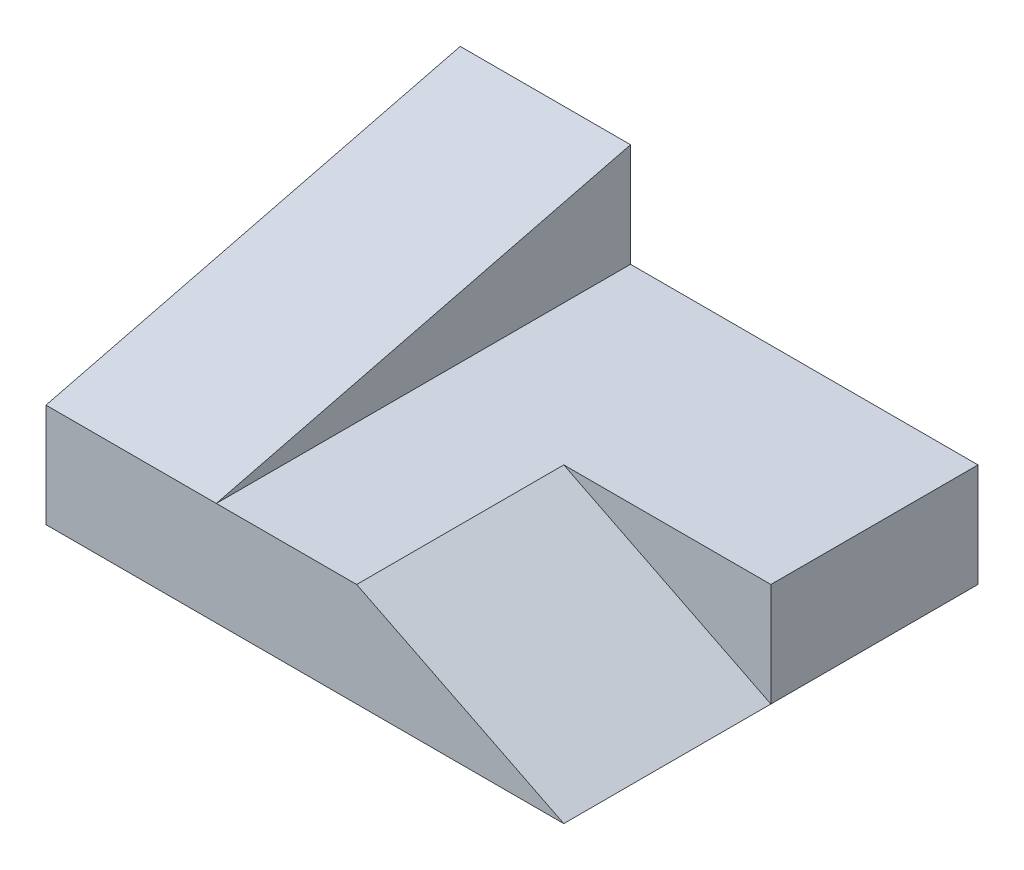
ISO-10303-21;
HEADER;
FILE_DESCRIPTION(('STEP AP214'),'2;1');
FILE_NAME('part.step','',(''),(''),'','','');
FILE_SCHEMA(('AUTOMOTIVE_DESIGN { 1 0 10303 214 1 1 1 1 }'));
ENDSEC;
DATA;
#1=APPLICATION_CONTEXT('core data for automotive mechanical design processes');
#2=APPLICATION_PROTOCOL_DEFINITION('international standard','automotive_design',2000,#1);
#3=PRODUCT_CONTEXT('',#1,'mechanical');
#4=PRODUCT('Part','Part','',(#3));
#5=PRODUCT_RELATED_PRODUCT_CATEGORY('part','',(#4));
#6=PRODUCT_DEFINITION_FORMATION('','',#4);
#7=PRODUCT_DEFINITION_CONTEXT('part definition',#1,'design');
#8=PRODUCT_DEFINITION('design','',#6,#7);
#9=PRODUCT_DEFINITION_SHAPE('','',#8);
#10=(LENGTH_UNIT() NAMED_UNIT(*) SI_UNIT(.MILLI.,.METRE.));
#11=(NAMED_UNIT(*) PLANE_ANGLE_UNIT() SI_UNIT($,.RADIAN.));
#12=(NAMED_UNIT(*) SI_UNIT($,.STERADIAN.) SOLID_ANGLE_UNIT());
#13=UNCERTAINTY_MEASURE_WITH_UNIT(LENGTH_MEASURE(1.E-05),#10,'distance_accuracy_value','');
#14=(GEOMETRIC_REPRESENTATION_CONTEXT(3) GLOBAL_UNCERTAINTY_ASSIGNED_CONTEXT((#13)) GLOBAL_UNIT_ASSIGNED_CONTEXT((#10,
#11,#12)) REPRESENTATION_CONTEXT('',''));
#15=CARTESIAN_POINT('',(0.,0.,0.));
#16=DIRECTION('',(0.,0.,1.));
#17=DIRECTION('',(1.,0.,0.));
#18=AXIS2_PLACEMENT_3D('',#15,#16,#17);
#19=CARTESIAN_POINT('',(0.,10.,0.));
#20=DIRECTION('',(0.,-1.,0.));
#21=DIRECTION('',(0.,0.,-1.));
#22=AXIS2_PLACEMENT_3D('',#19,#20,#21);
#23=PLANE('',#22);
#24=DIRECTION('',(1.,0.,0.));
#25=VECTOR('',#24,1.);
#26=CARTESIAN_POINT('',(-25.,10.,20.));
#27=LINE('',#26,#25);
#28=CARTESIAN_POINT('',(-8.55325315457413,10.,20.));
#29=VERTEX_POINT('',#28);
#30=CARTESIAN_POINT('',(4.99999999999999,10.,20.));
#31=VERTEX_POINT('',#30);
#32=EDGE_CURVE('E88',#29,#31,#27,.T.);
#33=ORIENTED_EDGE('',*,*,#32,.T.);
#34=DIRECTION('',(0.,0.,1.));
#35=VECTOR('',#34,1.);
#36=CARTESIAN_POINT('',(4.99999999999999,10.,0.));
#37=LINE('',#36,#35);
#38=CARTESIAN_POINT('',(4.99999999999999,10.,0.));
#39=VERTEX_POINT('',#38);
#40=EDGE_CURVE('E128',#39,#31,#37,.T.);
#41=ORIENTED_EDGE('',*,*,#40,.F.);
#42=DIRECTION('',(-1.,0.,0.));
#43=VECTOR('',#42,1.);
#44=CARTESIAN_POINT('',(25.,10.,0.));
#45=LINE('',#44,#43);
#46=CARTESIAN_POINT('',(25.,10.,0.));
#47=VERTEX_POINT('',#46);
#48=EDGE_CURVE('E134',#47,#39,#45,.T.);
#49=ORIENTED_EDGE('',*,*,#48,.F.);
#50=DIRECTION('',(0.,0.,-1.));
#51=VECTOR('',#50,1.);
#52=CARTESIAN_POINT('',(25.,10.,20.));
#53=LINE('',#52,#51);
#54=CARTESIAN_POINT('',(25.,10.,-20.));
#55=VERTEX_POINT('',#54);
#56=EDGE_CURVE('E56',#47,#55,#53,.T.);
#57=ORIENTED_EDGE('',*,*,#56,.T.);
#58=DIRECTION('',(-1.,0.,0.));
#59=VECTOR('',#58,1.);
#60=CARTESIAN_POINT('',(-25.,10.,-20.));
#61=LINE('',#60,#59);
#62=CARTESIAN_POINT('',(-8.55325315457413,10.,-20.));
#63=VERTEX_POINT('',#62);
#64=EDGE_CURVE('E104',#55,#63,#61,.T.);
#65=ORIENTED_EDGE('',*,*,#64,.T.);
#66=DIRECTION('',(0.,0.,-1.));
#67=VECTOR('',#66,1.);
#68=CARTESIAN_POINT('',(-8.55325315457413,10.,-20.));
#69=LINE('',#68,#67);
#70=EDGE_CURVE('E117',#29,#63,#69,.T.);
#71=ORIENTED_EDGE('',*,*,#70,.F.);
#72=EDGE_LOOP('',(#33,#41,#49,#57,#65,#71));
#73=FACE_BOUND('',#72,.T.);
#74=ADVANCED_FACE('F40',(#73),#23,.F.);
#75=CARTESIAN_POINT('',(25.,10.,20.));
#76=DIRECTION('',(-1.,0.,0.));
#77=DIRECTION('',(0.,0.,1.));
#78=AXIS2_PLACEMENT_3D('',#75,#76,#77);
#79=PLANE('',#78);
#80=ORIENTED_EDGE('',*,*,#56,.F.);
#81=DIRECTION('',(0.,1.,0.));
#82=VECTOR('',#81,1.);
#83=CARTESIAN_POINT('',(25.,0.,0.));
#84=LINE('',#83,#82);
#85=CARTESIAN_POINT('',(25.,0.,0.));
#86=VERTEX_POINT('',#85);
#87=EDGE_CURVE('E131',#86,#47,#84,.T.);
#88=ORIENTED_EDGE('',*,*,#87,.F.);
#89=DIRECTION('',(0.,0.,-1.));
#90=VECTOR('',#89,1.);
#91=CARTESIAN_POINT('',(25.,0.,20.));
#92=LINE('',#91,#90);
#93=CARTESIAN_POINT('',(25.,0.,-20.));
#94=VERTEX_POINT('',#93);
#95=EDGE_CURVE('E109',#86,#94,#92,.T.);
#96=ORIENTED_EDGE('',*,*,#95,.T.);
#97=DIRECTION('',(0.,-1.,0.));
#98=VECTOR('',#97,1.);
#99=CARTESIAN_POINT('',(25.,10.,-20.));
#100=LINE('',#99,#98);
#101=EDGE_CURVE('E12',#55,#94,#100,.T.);
#102=ORIENTED_EDGE('',*,*,#101,.F.);
#103=EDGE_LOOP('',(#80,#88,#96,#102));
#104=FACE_BOUND('',#103,.T.);
#105=ADVANCED_FACE('F42',(#104),#79,.F.);
#106=CARTESIAN_POINT('',(-25.,10.,-20.));
#107=DIRECTION('',(0.,0.,1.));
#108=DIRECTION('',(1.,0.,0.));
#109=AXIS2_PLACEMENT_3D('',#106,#107,#108);
#110=PLANE('',#109);
#111=DIRECTION('',(-1.,0.,0.));
#112=VECTOR('',#111,1.);
#113=CARTESIAN_POINT('',(-25.,0.,-20.));
#114=LINE('',#113,#112);
#115=CARTESIAN_POINT('',(-25.,0.,-20.));
#116=VERTEX_POINT('',#115);
#117=EDGE_CURVE('E97',#94,#116,#114,.T.);
#118=ORIENTED_EDGE('',*,*,#117,.T.);
#119=DIRECTION('',(0.,-1.,0.));
#120=VECTOR('',#119,1.);
#121=CARTESIAN_POINT('',(-25.,10.,-20.));
#122=LINE('',#121,#120);
#123=CARTESIAN_POINT('',(-25.,20.,-20.));
#124=VERTEX_POINT('',#123);
#125=EDGE_CURVE('E49',#124,#116,#122,.T.);
#126=ORIENTED_EDGE('',*,*,#125,.F.);
#127=DIRECTION('',(-1.,0.,0.));
#128=VECTOR('',#127,1.);
#129=CARTESIAN_POINT('',(-25.,20.,-20.));
#130=LINE('',#129,#128);
#131=CARTESIAN_POINT('',(-8.55325315457413,20.,-20.));
#132=VERTEX_POINT('',#131);
#133=EDGE_CURVE('E116',#132,#124,#130,.T.);
#134=ORIENTED_EDGE('',*,*,#133,.F.);
#135=DIRECTION('',(0.,-1.,0.));
#136=VECTOR('',#135,1.);
#137=CARTESIAN_POINT('',(-8.55325315457413,20.,-20.));
#138=LINE('',#137,#136);
#139=EDGE_CURVE('E113',#132,#63,#138,.T.);
#140=ORIENTED_EDGE('',*,*,#139,.T.);
#141=ORIENTED_EDGE('',*,*,#64,.F.);
#142=ORIENTED_EDGE('',*,*,#101,.T.);
#143=EDGE_LOOP('',(#118,#126,#134,#140,#141,#142));
#144=FACE_BOUND('',#143,.T.);
#145=ADVANCED_FACE('F170',(#144),#110,.F.);
#146=CARTESIAN_POINT('',(-25.,10.,20.));
#147=DIRECTION('',(1.,0.,0.));
#148=DIRECTION('',(0.,0.,-1.));
#149=AXIS2_PLACEMENT_3D('',#146,#147,#148);
#150=PLANE('',#149);
#151=DIRECTION('',(0.,-1.,0.));
#152=VECTOR('',#151,1.);
#153=CARTESIAN_POINT('',(-25.,10.,20.));
#154=LINE('',#153,#152);
#155=CARTESIAN_POINT('',(-25.,10.,20.));
#156=VERTEX_POINT('',#155);
#157=CARTESIAN_POINT('',(-25.,0.,20.));
#158=VERTEX_POINT('',#157);
#159=EDGE_CURVE('E75',#156,#158,#154,.T.);
#160=ORIENTED_EDGE('',*,*,#159,.F.);
#161=DIRECTION('',(0.,0.242535625036333,-0.970142500145332));
#162=VECTOR('',#161,1.);
#163=CARTESIAN_POINT('',(-25.,10.,20.));
#164=LINE('',#163,#162);
#165=EDGE_CURVE('E120',#156,#124,#164,.T.);
#166=ORIENTED_EDGE('',*,*,#165,.T.);
#167=ORIENTED_EDGE('',*,*,#125,.T.);
#168=DIRECTION('',(0.,0.,1.));
#169=VECTOR('',#168,1.);
#170=CARTESIAN_POINT('',(-25.,0.,20.));
#171=LINE('',#170,#169);
#172=EDGE_CURVE('E92',#116,#158,#171,.T.);
#173=ORIENTED_EDGE('',*,*,#172,.T.);
#174=EDGE_LOOP('',(#160,#166,#167,#173));
#175=FACE_BOUND('',#174,.T.);
#176=ADVANCED_FACE('F93',(#175),#150,.F.);
#177=CARTESIAN_POINT('',(-25.,10.,20.));
#178=DIRECTION('',(0.,0.,-1.));
#179=DIRECTION('',(-1.,0.,0.));
#180=AXIS2_PLACEMENT_3D('',#177,#178,#179);
#181=PLANE('',#180);
#182=DIRECTION('',(1.,0.,0.));
#183=VECTOR('',#182,1.);
#184=CARTESIAN_POINT('',(-25.,0.,20.));
#185=LINE('',#184,#183);
#186=CARTESIAN_POINT('',(25.,0.,20.));
#187=VERTEX_POINT('',#186);
#188=EDGE_CURVE('E80',#158,#187,#185,.T.);
#189=ORIENTED_EDGE('',*,*,#188,.T.);
#190=DIRECTION('',(0.894427190999916,-0.447213595499958,0.));
#191=VECTOR('',#190,1.);
#192=CARTESIAN_POINT('',(4.99999999999999,10.,20.));
#193=LINE('',#192,#191);
#194=EDGE_CURVE('E132',#31,#187,#193,.T.);
#195=ORIENTED_EDGE('',*,*,#194,.F.);
#196=ORIENTED_EDGE('',*,*,#32,.F.);
#197=DIRECTION('',(1.,0.,0.));
#198=VECTOR('',#197,1.);
#199=CARTESIAN_POINT('',(-28.5532531545741,10.,20.));
#200=LINE('',#199,#198);
#201=EDGE_CURVE('E85',#156,#29,#200,.T.);
#202=ORIENTED_EDGE('',*,*,#201,.F.);
#203=ORIENTED_EDGE('',*,*,#159,.T.);
#204=EDGE_LOOP('',(#189,#195,#196,#202,#203));
#205=FACE_BOUND('',#204,.T.);
#206=ADVANCED_FACE('F77',(#205),#181,.F.);
#207=CARTESIAN_POINT('',(0.,0.,0.));
#208=DIRECTION('',(0.,-1.,0.));
#209=DIRECTION('',(0.,0.,-1.));
#210=AXIS2_PLACEMENT_3D('',#207,#208,#209);
#211=PLANE('',#210);
#212=EDGE_CURVE('E102',#187,#86,#92,.T.);
#213=ORIENTED_EDGE('',*,*,#212,.F.);
#214=ORIENTED_EDGE('',*,*,#188,.F.);
#215=ORIENTED_EDGE('',*,*,#172,.F.);
#216=ORIENTED_EDGE('',*,*,#117,.F.);
#217=ORIENTED_EDGE('',*,*,#95,.F.);
#218=EDGE_LOOP('',(#213,#214,#215,#216,#217));
#219=FACE_BOUND('',#218,.T.);
#220=ADVANCED_FACE('F99',(#219),#211,.T.);
#221=CARTESIAN_POINT('',(-8.55325315457413,20.,-20.));
#222=DIRECTION('',(-1.,0.,0.));
#223=DIRECTION('',(0.,0.,1.));
#224=AXIS2_PLACEMENT_3D('',#221,#222,#223);
#225=PLANE('',#224);
#226=ORIENTED_EDGE('',*,*,#139,.F.);
#227=DIRECTION('',(0.,0.242535625036333,-0.970142500145332));
#228=VECTOR('',#227,1.);
#229=CARTESIAN_POINT('',(-8.55325315457413,10.,20.));
#230=LINE('',#229,#228);
#231=EDGE_CURVE('E125',#29,#132,#230,.T.);
#232=ORIENTED_EDGE('',*,*,#231,.F.);
#233=ORIENTED_EDGE('',*,*,#70,.T.);
#234=EDGE_LOOP('',(#226,#232,#233));
#235=FACE_BOUND('',#234,.T.);
#236=ADVANCED_FACE('F168',(#235),#225,.F.);
#237=CARTESIAN_POINT('',(-28.5532531545741,10.,20.));
#238=DIRECTION('',(0.,-0.970142500145332,-0.242535625036333));
#239=DIRECTION('',(0.,0.242535625036333,-0.970142500145332));
#240=AXIS2_PLACEMENT_3D('',#237,#238,#239);
#241=PLANE('',#240);
#242=ORIENTED_EDGE('',*,*,#201,.T.);
#243=ORIENTED_EDGE('',*,*,#231,.T.);
#244=ORIENTED_EDGE('',*,*,#133,.T.);
#245=ORIENTED_EDGE('',*,*,#165,.F.);
#246=EDGE_LOOP('',(#242,#243,#244,#245));
#247=FACE_BOUND('',#246,.T.);
#248=ADVANCED_FACE('F171',(#247),#241,.F.);
#249=CARTESIAN_POINT('',(4.99999999999999,10.,0.));
#250=DIRECTION('',(-0.447213595499958,-0.894427190999916,0.));
#251=DIRECTION('',(0.894427190999916,-0.447213595499958,0.));
#252=AXIS2_PLACEMENT_3D('',#249,#250,#251);
#253=PLANE('',#252);
#254=ORIENTED_EDGE('',*,*,#194,.T.);
#255=ORIENTED_EDGE('',*,*,#212,.T.);
#256=DIRECTION('',(0.894427190999916,-0.447213595499958,0.));
#257=VECTOR('',#256,1.);
#258=CARTESIAN_POINT('',(4.99999999999999,10.,0.));
#259=LINE('',#258,#257);
#260=EDGE_CURVE('E137',#39,#86,#259,.T.);
#261=ORIENTED_EDGE('',*,*,#260,.F.);
#262=ORIENTED_EDGE('',*,*,#40,.T.);
#263=EDGE_LOOP('',(#254,#255,#261,#262));
#264=FACE_BOUND('',#263,.T.);
#265=ADVANCED_FACE('F153',(#264),#253,.F.);
#266=CARTESIAN_POINT('',(0.,0.,0.));
#267=DIRECTION('',(0.,0.,-1.));
#268=DIRECTION('',(-1.,0.,0.));
#269=AXIS2_PLACEMENT_3D('',#266,#267,#268);
#270=PLANE('',#269);
#271=ORIENTED_EDGE('',*,*,#48,.T.);
#272=ORIENTED_EDGE('',*,*,#260,.T.);
#273=ORIENTED_EDGE('',*,*,#87,.T.);
#274=EDGE_LOOP('',(#271,#272,#273));
#275=FACE_BOUND('',#274,.T.);
#276=ADVANCED_FACE('F144',(#275),#270,.F.);
#277=CLOSED_SHELL('',(#74,#105,#145,#176,#206,#220,#236,#248,#265,#276));
#278=MANIFOLD_SOLID_BREP('B2',#277);
#279=ADVANCED_BREP_SHAPE_REPRESENTATION('',(#18,#278),#14);
#280=SHAPE_DEFINITION_REPRESENTATION(#9,#279);
ENDSEC;
END-ISO-10303-21;
